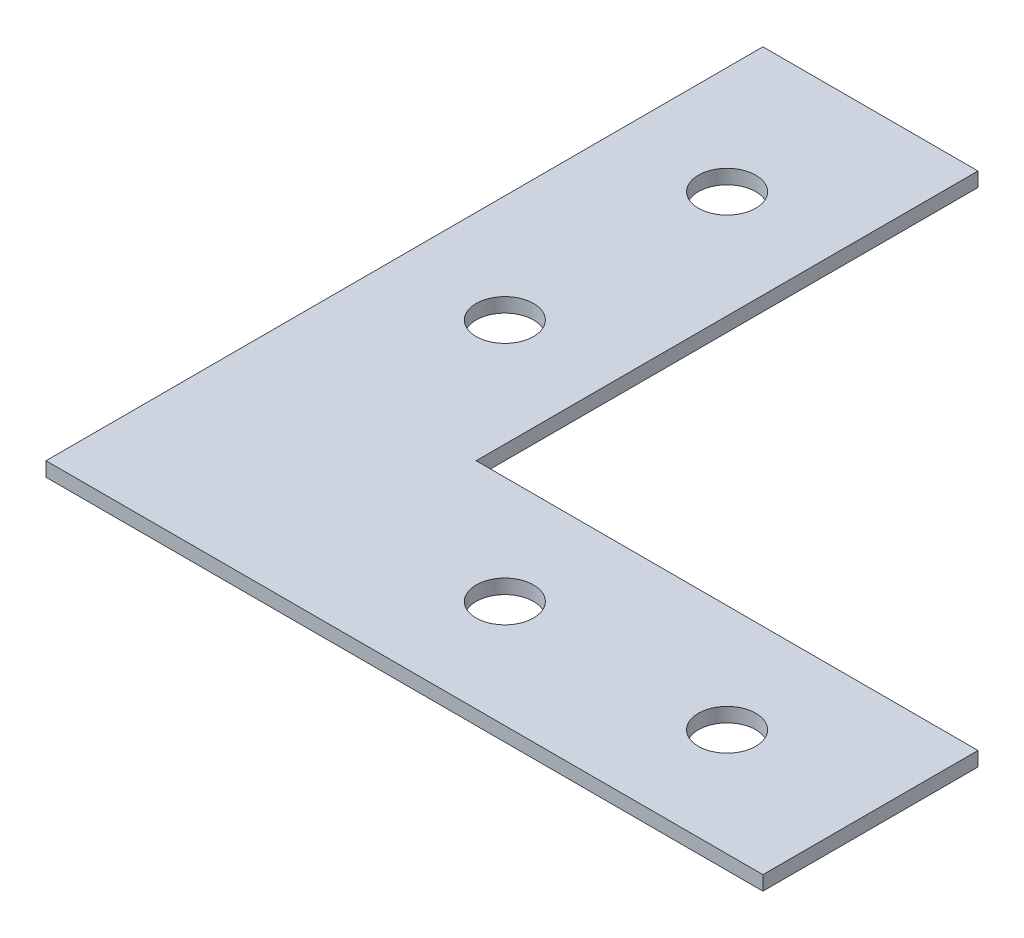
ISO-10303-21;
HEADER;
FILE_DESCRIPTION(('STEP AP214'),'2;1');
FILE_NAME('part.step','',(''),(''),'','','');
FILE_SCHEMA(('AUTOMOTIVE_DESIGN { 1 0 10303 214 1 1 1 1 }'));
ENDSEC;
DATA;
#1=APPLICATION_CONTEXT('core data for automotive mechanical design processes');
#2=APPLICATION_PROTOCOL_DEFINITION('international standard','automotive_design',2000,#1);
#3=PRODUCT_CONTEXT('',#1,'mechanical');
#4=PRODUCT('Part','Part','',(#3));
#5=PRODUCT_RELATED_PRODUCT_CATEGORY('part','',(#4));
#6=PRODUCT_DEFINITION_FORMATION('','',#4);
#7=PRODUCT_DEFINITION_CONTEXT('part definition',#1,'design');
#8=PRODUCT_DEFINITION('design','',#6,#7);
#9=PRODUCT_DEFINITION_SHAPE('','',#8);
#10=(LENGTH_UNIT() NAMED_UNIT(*) SI_UNIT(.MILLI.,.METRE.));
#11=(NAMED_UNIT(*) PLANE_ANGLE_UNIT() SI_UNIT($,.RADIAN.));
#12=(NAMED_UNIT(*) SI_UNIT($,.STERADIAN.) SOLID_ANGLE_UNIT());
#13=UNCERTAINTY_MEASURE_WITH_UNIT(LENGTH_MEASURE(1.E-05),#10,'distance_accuracy_value','');
#14=(GEOMETRIC_REPRESENTATION_CONTEXT(3) GLOBAL_UNCERTAINTY_ASSIGNED_CONTEXT((#13)) GLOBAL_UNIT_ASSIGNED_CONTEXT((#10,
#11,#12)) REPRESENTATION_CONTEXT('',''));
#15=CARTESIAN_POINT('',(0.,0.,0.));
#16=DIRECTION('',(0.,0.,1.));
#17=DIRECTION('',(1.,0.,0.));
#18=AXIS2_PLACEMENT_3D('',#15,#16,#17);
#19=CARTESIAN_POINT('',(0.,1.,0.));
#20=DIRECTION('',(0.,-1.,0.));
#21=DIRECTION('',(0.,0.,-1.));
#22=AXIS2_PLACEMENT_3D('',#19,#20,#21);
#23=PLANE('',#22);
#24=CARTESIAN_POINT('',(7.5,1.,-24.5));
#25=DIRECTION('',(0.,1.,0.));
#26=DIRECTION('',(0.,0.,1.));
#27=AXIS2_PLACEMENT_3D('',#24,#25,#26);
#28=CIRCLE('',#27,2.);
#29=CARTESIAN_POINT('',(7.5,1.,-22.5));
#30=VERTEX_POINT('',#29);
#31=EDGE_CURVE('E212',#30,#30,#28,.T.);
#32=ORIENTED_EDGE('',*,*,#31,.F.);
#33=EDGE_LOOP('',(#32));
#34=FACE_BOUND('',#33,.T.);
#35=CARTESIAN_POINT('',(24.5,1.,-7.5));
#36=DIRECTION('',(0.,1.,0.));
#37=DIRECTION('',(0.,0.,1.));
#38=AXIS2_PLACEMENT_3D('',#35,#36,#37);
#39=CIRCLE('',#38,2.);
#40=CARTESIAN_POINT('',(24.5,1.,-5.5));
#41=VERTEX_POINT('',#40);
#42=EDGE_CURVE('E222',#41,#41,#39,.F.);
#43=ORIENTED_EDGE('',*,*,#42,.T.);
#44=EDGE_LOOP('',(#43));
#45=FACE_BOUND('',#44,.T.);
#46=CARTESIAN_POINT('',(40.,1.,-7.50000000000001));
#47=DIRECTION('',(0.,1.,0.));
#48=DIRECTION('',(0.,0.,1.));
#49=AXIS2_PLACEMENT_3D('',#46,#47,#48);
#50=CIRCLE('',#49,2.);
#51=CARTESIAN_POINT('',(40.,1.,-5.50000000000001));
#52=VERTEX_POINT('',#51);
#53=EDGE_CURVE('E230',#52,#52,#50,.F.);
#54=ORIENTED_EDGE('',*,*,#53,.T.);
#55=EDGE_LOOP('',(#54));
#56=FACE_BOUND('',#55,.T.);
#57=DIRECTION('',(1.,0.,0.));
#58=VECTOR('',#57,1.);
#59=CARTESIAN_POINT('',(50.,1.,0.));
#60=LINE('',#59,#58);
#61=CARTESIAN_POINT('',(0.,1.,0.));
#62=VERTEX_POINT('',#61);
#63=CARTESIAN_POINT('',(50.,1.,0.));
#64=VERTEX_POINT('',#63);
#65=EDGE_CURVE('E146',#62,#64,#60,.T.);
#66=ORIENTED_EDGE('',*,*,#65,.T.);
#67=DIRECTION('',(0.,0.,-1.));
#68=VECTOR('',#67,1.);
#69=CARTESIAN_POINT('',(50.,1.,-15.));
#70=LINE('',#69,#68);
#71=CARTESIAN_POINT('',(50.,1.,-15.));
#72=VERTEX_POINT('',#71);
#73=EDGE_CURVE('E94',#64,#72,#70,.T.);
#74=ORIENTED_EDGE('',*,*,#73,.T.);
#75=DIRECTION('',(-1.,0.,0.));
#76=VECTOR('',#75,1.);
#77=CARTESIAN_POINT('',(15.,1.,-15.));
#78=LINE('',#77,#76);
#79=CARTESIAN_POINT('',(15.,1.,-15.));
#80=VERTEX_POINT('',#79);
#81=EDGE_CURVE('E107',#72,#80,#78,.T.);
#82=ORIENTED_EDGE('',*,*,#81,.T.);
#83=DIRECTION('',(0.,0.,-1.));
#84=VECTOR('',#83,1.);
#85=CARTESIAN_POINT('',(15.,1.,-50.));
#86=LINE('',#85,#84);
#87=CARTESIAN_POINT('',(15.,1.,-50.));
#88=VERTEX_POINT('',#87);
#89=EDGE_CURVE('E101',#80,#88,#86,.T.);
#90=ORIENTED_EDGE('',*,*,#89,.T.);
#91=DIRECTION('',(-1.,0.,0.));
#92=VECTOR('',#91,1.);
#93=CARTESIAN_POINT('',(0.,1.,-50.));
#94=LINE('',#93,#92);
#95=CARTESIAN_POINT('',(0.,1.,-50.));
#96=VERTEX_POINT('',#95);
#97=EDGE_CURVE('E105',#88,#96,#94,.T.);
#98=ORIENTED_EDGE('',*,*,#97,.T.);
#99=DIRECTION('',(0.,0.,1.));
#100=VECTOR('',#99,1.);
#101=CARTESIAN_POINT('',(0.,1.,0.));
#102=LINE('',#101,#100);
#103=EDGE_CURVE('E57',#96,#62,#102,.T.);
#104=ORIENTED_EDGE('',*,*,#103,.T.);
#105=EDGE_LOOP('',(#66,#74,#82,#90,#98,#104));
#106=FACE_BOUND('',#105,.T.);
#107=CARTESIAN_POINT('',(7.5,1.,-40.));
#108=DIRECTION('',(0.,1.,0.));
#109=DIRECTION('',(0.,0.,1.));
#110=AXIS2_PLACEMENT_3D('',#107,#108,#109);
#111=CIRCLE('',#110,2.);
#112=CARTESIAN_POINT('',(7.5,1.,-38.));
#113=VERTEX_POINT('',#112);
#114=EDGE_CURVE('E204',#113,#113,#111,.T.);
#115=ORIENTED_EDGE('',*,*,#114,.F.);
#116=EDGE_LOOP('',(#115));
#117=FACE_BOUND('',#116,.T.);
#118=ADVANCED_FACE('F39',(#34,#45,#56,#106,#117),#23,.F.);
#119=CARTESIAN_POINT('',(0.,0.,0.));
#120=DIRECTION('',(0.,-1.,0.));
#121=DIRECTION('',(0.,0.,-1.));
#122=AXIS2_PLACEMENT_3D('',#119,#120,#121);
#123=PLANE('',#122);
#124=CARTESIAN_POINT('',(24.5,0.,-7.5));
#125=DIRECTION('',(0.,1.,0.));
#126=DIRECTION('',(0.,0.,1.));
#127=AXIS2_PLACEMENT_3D('',#124,#125,#126);
#128=CIRCLE('',#127,2.);
#129=CARTESIAN_POINT('',(24.5,0.,-5.5));
#130=VERTEX_POINT('',#129);
#131=EDGE_CURVE('E218',#130,#130,#128,.F.);
#132=ORIENTED_EDGE('',*,*,#131,.F.);
#133=EDGE_LOOP('',(#132));
#134=FACE_BOUND('',#133,.T.);
#135=CARTESIAN_POINT('',(40.,0.,-7.50000000000001));
#136=DIRECTION('',(0.,1.,0.));
#137=DIRECTION('',(0.,0.,1.));
#138=AXIS2_PLACEMENT_3D('',#135,#136,#137);
#139=CIRCLE('',#138,2.);
#140=CARTESIAN_POINT('',(40.,0.,-5.50000000000001));
#141=VERTEX_POINT('',#140);
#142=EDGE_CURVE('E226',#141,#141,#139,.F.);
#143=ORIENTED_EDGE('',*,*,#142,.F.);
#144=EDGE_LOOP('',(#143));
#145=FACE_BOUND('',#144,.T.);
#146=DIRECTION('',(1.,0.,0.));
#147=VECTOR('',#146,1.);
#148=CARTESIAN_POINT('',(50.,0.,0.));
#149=LINE('',#148,#147);
#150=CARTESIAN_POINT('',(0.,0.,0.));
#151=VERTEX_POINT('',#150);
#152=CARTESIAN_POINT('',(50.,0.,0.));
#153=VERTEX_POINT('',#152);
#154=EDGE_CURVE('E129',#151,#153,#149,.T.);
#155=ORIENTED_EDGE('',*,*,#154,.F.);
#156=DIRECTION('',(0.,0.,1.));
#157=VECTOR('',#156,1.);
#158=CARTESIAN_POINT('',(0.,0.,0.));
#159=LINE('',#158,#157);
#160=CARTESIAN_POINT('',(0.,0.,-50.));
#161=VERTEX_POINT('',#160);
#162=EDGE_CURVE('E86',#161,#151,#159,.T.);
#163=ORIENTED_EDGE('',*,*,#162,.F.);
#164=DIRECTION('',(-1.,0.,0.));
#165=VECTOR('',#164,1.);
#166=CARTESIAN_POINT('',(0.,0.,-50.));
#167=LINE('',#166,#165);
#168=CARTESIAN_POINT('',(15.,0.,-50.));
#169=VERTEX_POINT('',#168);
#170=EDGE_CURVE('E80',#169,#161,#167,.T.);
#171=ORIENTED_EDGE('',*,*,#170,.F.);
#172=DIRECTION('',(0.,0.,-1.));
#173=VECTOR('',#172,1.);
#174=CARTESIAN_POINT('',(15.,0.,-50.));
#175=LINE('',#174,#173);
#176=CARTESIAN_POINT('',(15.,0.,-15.));
#177=VERTEX_POINT('',#176);
#178=EDGE_CURVE('E116',#177,#169,#175,.T.);
#179=ORIENTED_EDGE('',*,*,#178,.F.);
#180=DIRECTION('',(-1.,0.,0.));
#181=VECTOR('',#180,1.);
#182=CARTESIAN_POINT('',(15.,0.,-15.));
#183=LINE('',#182,#181);
#184=CARTESIAN_POINT('',(50.,0.,-15.));
#185=VERTEX_POINT('',#184);
#186=EDGE_CURVE('E137',#185,#177,#183,.T.);
#187=ORIENTED_EDGE('',*,*,#186,.F.);
#188=DIRECTION('',(0.,0.,-1.));
#189=VECTOR('',#188,1.);
#190=CARTESIAN_POINT('',(50.,0.,-15.));
#191=LINE('',#190,#189);
#192=EDGE_CURVE('E133',#153,#185,#191,.T.);
#193=ORIENTED_EDGE('',*,*,#192,.F.);
#194=EDGE_LOOP('',(#155,#163,#171,#179,#187,#193));
#195=FACE_BOUND('',#194,.T.);
#196=CARTESIAN_POINT('',(7.5,0.,-24.5));
#197=DIRECTION('',(0.,1.,0.));
#198=DIRECTION('',(0.,0.,1.));
#199=AXIS2_PLACEMENT_3D('',#196,#197,#198);
#200=CIRCLE('',#199,2.);
#201=CARTESIAN_POINT('',(7.5,0.,-22.5));
#202=VERTEX_POINT('',#201);
#203=EDGE_CURVE('E206',#202,#202,#200,.T.);
#204=ORIENTED_EDGE('',*,*,#203,.T.);
#205=EDGE_LOOP('',(#204));
#206=FACE_BOUND('',#205,.T.);
#207=CARTESIAN_POINT('',(7.5,0.,-40.));
#208=DIRECTION('',(0.,1.,0.));
#209=DIRECTION('',(0.,0.,1.));
#210=AXIS2_PLACEMENT_3D('',#207,#208,#209);
#211=CIRCLE('',#210,2.);
#212=CARTESIAN_POINT('',(7.5,0.,-38.));
#213=VERTEX_POINT('',#212);
#214=EDGE_CURVE('E134',#213,#213,#211,.T.);
#215=ORIENTED_EDGE('',*,*,#214,.T.);
#216=EDGE_LOOP('',(#215));
#217=FACE_BOUND('',#216,.T.);
#218=ADVANCED_FACE('F159',(#134,#145,#195,#206,#217),#123,.T.);
#219=CARTESIAN_POINT('',(50.,1.,0.));
#220=DIRECTION('',(0.,0.,-1.));
#221=DIRECTION('',(-1.,0.,0.));
#222=AXIS2_PLACEMENT_3D('',#219,#220,#221);
#223=PLANE('',#222);
#224=ORIENTED_EDGE('',*,*,#154,.T.);
#225=DIRECTION('',(0.,-1.,0.));
#226=VECTOR('',#225,1.);
#227=CARTESIAN_POINT('',(50.,1.,0.));
#228=LINE('',#227,#226);
#229=EDGE_CURVE('E11',#64,#153,#228,.T.);
#230=ORIENTED_EDGE('',*,*,#229,.F.);
#231=ORIENTED_EDGE('',*,*,#65,.F.);
#232=DIRECTION('',(0.,-1.,0.));
#233=VECTOR('',#232,1.);
#234=CARTESIAN_POINT('',(0.,1.,0.));
#235=LINE('',#234,#233);
#236=EDGE_CURVE('E125',#62,#151,#235,.T.);
#237=ORIENTED_EDGE('',*,*,#236,.T.);
#238=EDGE_LOOP('',(#224,#230,#231,#237));
#239=FACE_BOUND('',#238,.T.);
#240=ADVANCED_FACE('F41',(#239),#223,.F.);
#241=CARTESIAN_POINT('',(50.,1.,-15.));
#242=DIRECTION('',(-1.,0.,0.));
#243=DIRECTION('',(0.,0.,1.));
#244=AXIS2_PLACEMENT_3D('',#241,#242,#243);
#245=PLANE('',#244);
#246=ORIENTED_EDGE('',*,*,#192,.T.);
#247=DIRECTION('',(0.,-1.,0.));
#248=VECTOR('',#247,1.);
#249=CARTESIAN_POINT('',(50.,1.,-15.));
#250=LINE('',#249,#248);
#251=EDGE_CURVE('E49',#72,#185,#250,.T.);
#252=ORIENTED_EDGE('',*,*,#251,.F.);
#253=ORIENTED_EDGE('',*,*,#73,.F.);
#254=ORIENTED_EDGE('',*,*,#229,.T.);
#255=EDGE_LOOP('',(#246,#252,#253,#254));
#256=FACE_BOUND('',#255,.T.);
#257=ADVANCED_FACE('F299',(#256),#245,.F.);
#258=CARTESIAN_POINT('',(15.,1.,-15.));
#259=DIRECTION('',(0.,0.,1.));
#260=DIRECTION('',(1.,0.,0.));
#261=AXIS2_PLACEMENT_3D('',#258,#259,#260);
#262=PLANE('',#261);
#263=ORIENTED_EDGE('',*,*,#186,.T.);
#264=DIRECTION('',(0.,-1.,0.));
#265=VECTOR('',#264,1.);
#266=CARTESIAN_POINT('',(15.,1.,-15.));
#267=LINE('',#266,#265);
#268=EDGE_CURVE('E118',#80,#177,#267,.T.);
#269=ORIENTED_EDGE('',*,*,#268,.F.);
#270=ORIENTED_EDGE('',*,*,#81,.F.);
#271=ORIENTED_EDGE('',*,*,#251,.T.);
#272=EDGE_LOOP('',(#263,#269,#270,#271));
#273=FACE_BOUND('',#272,.T.);
#274=ADVANCED_FACE('F156',(#273),#262,.F.);
#275=CARTESIAN_POINT('',(15.,1.,-50.));
#276=DIRECTION('',(-1.,0.,0.));
#277=DIRECTION('',(0.,0.,1.));
#278=AXIS2_PLACEMENT_3D('',#275,#276,#277);
#279=PLANE('',#278);
#280=ORIENTED_EDGE('',*,*,#178,.T.);
#281=DIRECTION('',(0.,-1.,0.));
#282=VECTOR('',#281,1.);
#283=CARTESIAN_POINT('',(15.,1.,-50.));
#284=LINE('',#283,#282);
#285=EDGE_CURVE('E113',#88,#169,#284,.T.);
#286=ORIENTED_EDGE('',*,*,#285,.F.);
#287=ORIENTED_EDGE('',*,*,#89,.F.);
#288=ORIENTED_EDGE('',*,*,#268,.T.);
#289=EDGE_LOOP('',(#280,#286,#287,#288));
#290=FACE_BOUND('',#289,.T.);
#291=ADVANCED_FACE('F114',(#290),#279,.F.);
#292=CARTESIAN_POINT('',(0.,1.,-50.));
#293=DIRECTION('',(0.,0.,1.));
#294=DIRECTION('',(1.,0.,0.));
#295=AXIS2_PLACEMENT_3D('',#292,#293,#294);
#296=PLANE('',#295);
#297=ORIENTED_EDGE('',*,*,#170,.T.);
#298=DIRECTION('',(0.,-1.,0.));
#299=VECTOR('',#298,1.);
#300=CARTESIAN_POINT('',(0.,1.,-50.));
#301=LINE('',#300,#299);
#302=EDGE_CURVE('E119',#96,#161,#301,.T.);
#303=ORIENTED_EDGE('',*,*,#302,.F.);
#304=ORIENTED_EDGE('',*,*,#97,.F.);
#305=ORIENTED_EDGE('',*,*,#285,.T.);
#306=EDGE_LOOP('',(#297,#303,#304,#305));
#307=FACE_BOUND('',#306,.T.);
#308=ADVANCED_FACE('F121',(#307),#296,.F.);
#309=CARTESIAN_POINT('',(0.,1.,0.));
#310=DIRECTION('',(1.,0.,0.));
#311=DIRECTION('',(0.,0.,-1.));
#312=AXIS2_PLACEMENT_3D('',#309,#310,#311);
#313=PLANE('',#312);
#314=ORIENTED_EDGE('',*,*,#162,.T.);
#315=ORIENTED_EDGE('',*,*,#236,.F.);
#316=ORIENTED_EDGE('',*,*,#103,.F.);
#317=ORIENTED_EDGE('',*,*,#302,.T.);
#318=EDGE_LOOP('',(#314,#315,#316,#317));
#319=FACE_BOUND('',#318,.T.);
#320=ADVANCED_FACE('F164',(#319),#313,.F.);
#321=CARTESIAN_POINT('',(40.,0.,-7.50000000000001));
#322=DIRECTION('',(0.,1.,0.));
#323=DIRECTION('',(0.,0.,1.));
#324=AXIS2_PLACEMENT_3D('',#321,#322,#323);
#325=CYLINDRICAL_SURFACE('',#324,2.);
#326=ORIENTED_EDGE('',*,*,#142,.T.);
#327=EDGE_LOOP('',(#326));
#328=FACE_BOUND('',#327,.T.);
#329=ORIENTED_EDGE('',*,*,#53,.F.);
#330=EDGE_LOOP('',(#329));
#331=FACE_BOUND('',#330,.T.);
#332=ADVANCED_FACE('F166',(#328,#331),#325,.F.);
#333=CARTESIAN_POINT('',(24.5,0.,-7.5));
#334=DIRECTION('',(0.,1.,0.));
#335=DIRECTION('',(0.,0.,1.));
#336=AXIS2_PLACEMENT_3D('',#333,#334,#335);
#337=CYLINDRICAL_SURFACE('',#336,2.);
#338=ORIENTED_EDGE('',*,*,#131,.T.);
#339=EDGE_LOOP('',(#338));
#340=FACE_BOUND('',#339,.T.);
#341=ORIENTED_EDGE('',*,*,#42,.F.);
#342=EDGE_LOOP('',(#341));
#343=FACE_BOUND('',#342,.T.);
#344=ADVANCED_FACE('F172',(#340,#343),#337,.F.);
#345=CARTESIAN_POINT('',(7.5,0.,-24.5));
#346=DIRECTION('',(0.,1.,0.));
#347=DIRECTION('',(0.,0.,1.));
#348=AXIS2_PLACEMENT_3D('',#345,#346,#347);
#349=CYLINDRICAL_SURFACE('',#348,2.);
#350=ORIENTED_EDGE('',*,*,#203,.F.);
#351=EDGE_LOOP('',(#350));
#352=FACE_BOUND('',#351,.T.);
#353=ORIENTED_EDGE('',*,*,#31,.T.);
#354=EDGE_LOOP('',(#353));
#355=FACE_BOUND('',#354,.T.);
#356=ADVANCED_FACE('F189',(#352,#355),#349,.F.);
#357=CARTESIAN_POINT('',(7.5,0.,-40.));
#358=DIRECTION('',(0.,1.,0.));
#359=DIRECTION('',(0.,0.,1.));
#360=AXIS2_PLACEMENT_3D('',#357,#358,#359);
#361=CYLINDRICAL_SURFACE('',#360,2.);
#362=ORIENTED_EDGE('',*,*,#214,.F.);
#363=EDGE_LOOP('',(#362));
#364=FACE_BOUND('',#363,.T.);
#365=ORIENTED_EDGE('',*,*,#114,.T.);
#366=EDGE_LOOP('',(#365));
#367=FACE_BOUND('',#366,.T.);
#368=ADVANCED_FACE('F193',(#364,#367),#361,.F.);
#369=CLOSED_SHELL('',(#118,#218,#240,#257,#274,#291,#308,#320,#332,#344,#356,#368));
#370=MANIFOLD_SOLID_BREP('B2',#369);
#371=ADVANCED_BREP_SHAPE_REPRESENTATION('',(#18,#370),#14);
#372=SHAPE_DEFINITION_REPRESENTATION(#9,#371);
ENDSEC;
END-ISO-10303-21;
